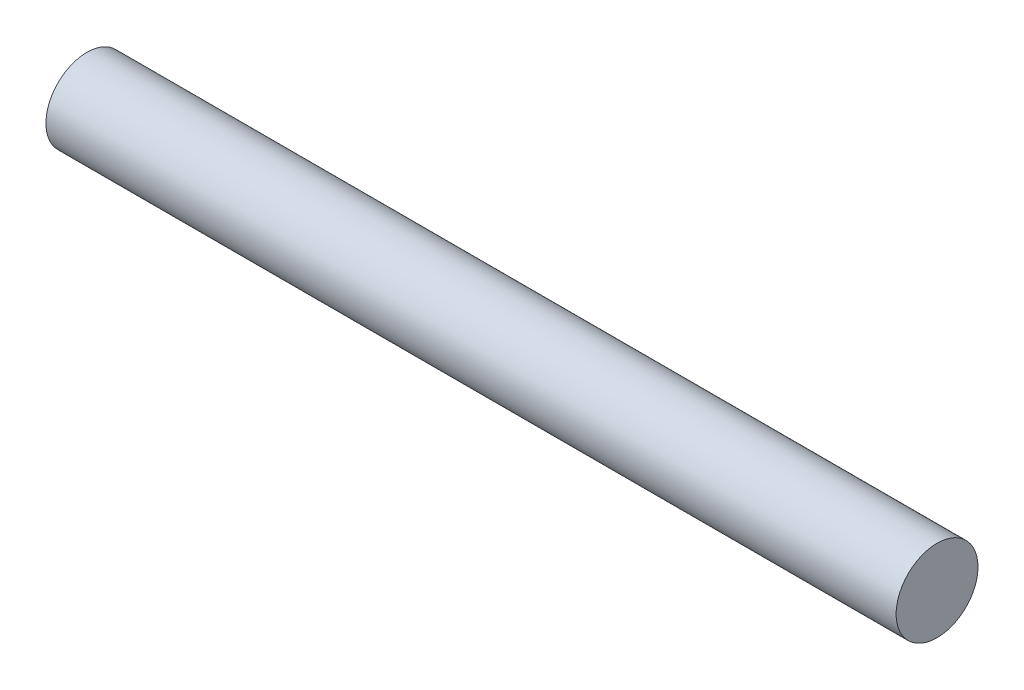
ISO-10303-21;
HEADER;
FILE_DESCRIPTION(('STEP AP214'),'2;1');
FILE_NAME('part.step','',(''),(''),'','','');
FILE_SCHEMA(('AUTOMOTIVE_DESIGN { 1 0 10303 214 1 1 1 1 }'));
ENDSEC;
DATA;
#1=APPLICATION_CONTEXT('core data for automotive mechanical design processes');
#2=APPLICATION_PROTOCOL_DEFINITION('international standard','automotive_design',2000,#1);
#3=PRODUCT_CONTEXT('',#1,'mechanical');
#4=PRODUCT('Part','Part','',(#3));
#5=PRODUCT_RELATED_PRODUCT_CATEGORY('part','',(#4));
#6=PRODUCT_DEFINITION_FORMATION('','',#4);
#7=PRODUCT_DEFINITION_CONTEXT('part definition',#1,'design');
#8=PRODUCT_DEFINITION('design','',#6,#7);
#9=PRODUCT_DEFINITION_SHAPE('','',#8);
#10=(LENGTH_UNIT() NAMED_UNIT(*) SI_UNIT(.MILLI.,.METRE.));
#11=(NAMED_UNIT(*) PLANE_ANGLE_UNIT() SI_UNIT($,.RADIAN.));
#12=(NAMED_UNIT(*) SI_UNIT($,.STERADIAN.) SOLID_ANGLE_UNIT());
#13=UNCERTAINTY_MEASURE_WITH_UNIT(LENGTH_MEASURE(1.E-05),#10,'distance_accuracy_value','');
#14=(GEOMETRIC_REPRESENTATION_CONTEXT(3) GLOBAL_UNCERTAINTY_ASSIGNED_CONTEXT((#13)) GLOBAL_UNIT_ASSIGNED_CONTEXT((#10,
#11,#12)) REPRESENTATION_CONTEXT('',''));
#15=CARTESIAN_POINT('',(0.,0.,0.));
#16=DIRECTION('',(0.,0.,1.));
#17=DIRECTION('',(1.,0.,0.));
#18=AXIS2_PLACEMENT_3D('',#15,#16,#17);
#19=CARTESIAN_POINT('',(3.429,0.,0.));
#20=DIRECTION('',(-1.,0.,0.));
#21=DIRECTION('',(0.,0.,1.));
#22=AXIS2_PLACEMENT_3D('',#19,#20,#21);
#23=CYLINDRICAL_SURFACE('',#22,0.1651);
#24=CARTESIAN_POINT('',(3.429,0.,0.));
#25=DIRECTION('',(1.,0.,0.));
#26=DIRECTION('',(0.,0.,-1.));
#27=AXIS2_PLACEMENT_3D('',#24,#25,#26);
#28=CIRCLE('',#27,0.1651);
#29=CARTESIAN_POINT('',(3.429,0.,-0.1651));
#30=VERTEX_POINT('',#29);
#31=EDGE_CURVE('E10',#30,#30,#28,.T.);
#32=ORIENTED_EDGE('',*,*,#31,.F.);
#33=EDGE_LOOP('',(#32));
#34=FACE_BOUND('',#33,.T.);
#35=CARTESIAN_POINT('',(0.,0.,0.));
#36=DIRECTION('',(1.,0.,0.));
#37=DIRECTION('',(0.,0.,-1.));
#38=AXIS2_PLACEMENT_3D('',#35,#36,#37);
#39=CIRCLE('',#38,0.1651);
#40=CARTESIAN_POINT('',(0.,0.,-0.1651));
#41=VERTEX_POINT('',#40);
#42=EDGE_CURVE('E39',#41,#41,#39,.T.);
#43=ORIENTED_EDGE('',*,*,#42,.T.);
#44=EDGE_LOOP('',(#43));
#45=FACE_BOUND('',#44,.T.);
#46=ADVANCED_FACE('F36',(#34,#45),#23,.T.);
#47=CARTESIAN_POINT('',(3.429,0.,0.));
#48=DIRECTION('',(1.,0.,0.));
#49=DIRECTION('',(0.,0.,-1.));
#50=AXIS2_PLACEMENT_3D('',#47,#48,#49);
#51=PLANE('',#50);
#52=ORIENTED_EDGE('',*,*,#31,.T.);
#53=EDGE_LOOP('',(#52));
#54=FACE_BOUND('',#53,.T.);
#55=ADVANCED_FACE('F51',(#54),#51,.T.);
#56=CARTESIAN_POINT('',(0.,0.,0.));
#57=DIRECTION('',(1.,0.,0.));
#58=DIRECTION('',(0.,0.,-1.));
#59=AXIS2_PLACEMENT_3D('',#56,#57,#58);
#60=PLANE('',#59);
#61=ORIENTED_EDGE('',*,*,#42,.F.);
#62=EDGE_LOOP('',(#61));
#63=FACE_BOUND('',#62,.T.);
#64=ADVANCED_FACE('F49',(#63),#60,.F.);
#65=CLOSED_SHELL('',(#46,#55,#64));
#66=MANIFOLD_SOLID_BREP('B2',#65);
#67=ADVANCED_BREP_SHAPE_REPRESENTATION('',(#18,#66),#14);
#68=SHAPE_DEFINITION_REPRESENTATION(#9,#67);
ENDSEC;
END-ISO-10303-21;
